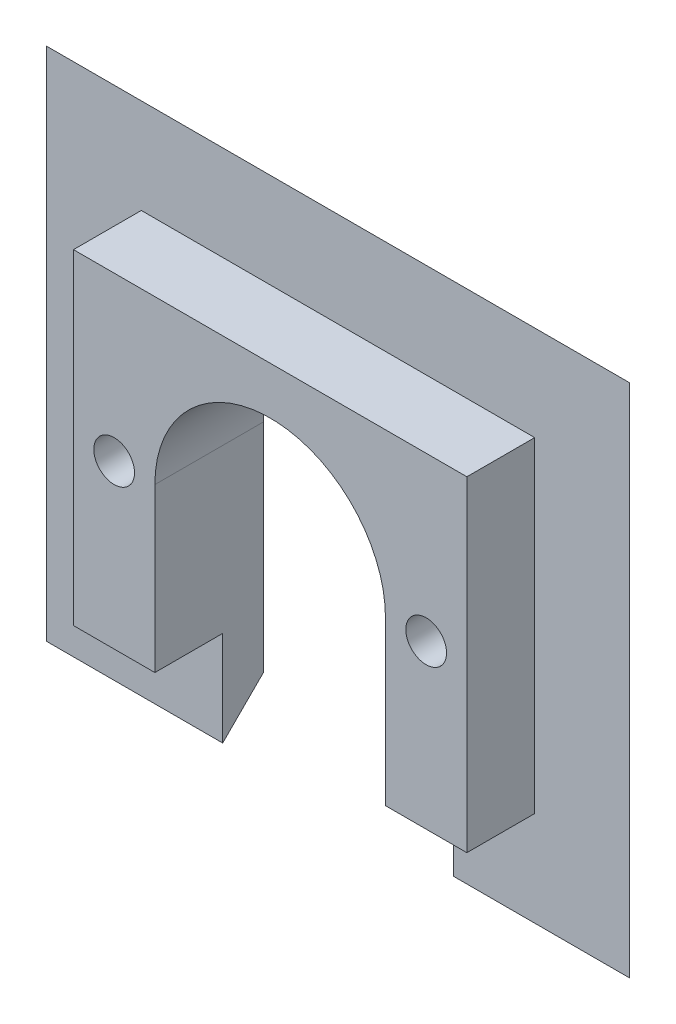
ISO-10303-21;
HEADER;
FILE_DESCRIPTION(('STEP AP214'),'2;1');
FILE_NAME('part.step','',(''),(''),'','','');
FILE_SCHEMA(('AUTOMOTIVE_DESIGN { 1 0 10303 214 1 1 1 1 }'));
ENDSEC;
DATA;
#1=APPLICATION_CONTEXT('core data for automotive mechanical design processes');
#2=APPLICATION_PROTOCOL_DEFINITION('international standard','automotive_design',2000,#1);
#3=PRODUCT_CONTEXT('',#1,'mechanical');
#4=PRODUCT('Part','Part','',(#3));
#5=PRODUCT_RELATED_PRODUCT_CATEGORY('part','',(#4));
#6=PRODUCT_DEFINITION_FORMATION('','',#4);
#7=PRODUCT_DEFINITION_CONTEXT('part definition',#1,'design');
#8=PRODUCT_DEFINITION('design','',#6,#7);
#9=PRODUCT_DEFINITION_SHAPE('','',#8);
#10=(LENGTH_UNIT() NAMED_UNIT(*) SI_UNIT(.MILLI.,.METRE.));
#11=(NAMED_UNIT(*) PLANE_ANGLE_UNIT() SI_UNIT($,.RADIAN.));
#12=(NAMED_UNIT(*) SI_UNIT($,.STERADIAN.) SOLID_ANGLE_UNIT());
#13=UNCERTAINTY_MEASURE_WITH_UNIT(LENGTH_MEASURE(1.E-05),#10,'distance_accuracy_value','');
#14=(GEOMETRIC_REPRESENTATION_CONTEXT(3) GLOBAL_UNCERTAINTY_ASSIGNED_CONTEXT((#13)) GLOBAL_UNIT_ASSIGNED_CONTEXT((#10,
#11,#12)) REPRESENTATION_CONTEXT('',''));
#15=CARTESIAN_POINT('',(0.,0.,0.));
#16=DIRECTION('',(0.,0.,1.));
#17=DIRECTION('',(1.,0.,0.));
#18=AXIS2_PLACEMENT_3D('',#15,#16,#17);
#19=CARTESIAN_POINT('',(0.,0.,5.));
#20=DIRECTION('',(0.,0.,-1.));
#21=DIRECTION('',(-1.,0.,0.));
#22=AXIS2_PLACEMENT_3D('',#19,#20,#21);
#23=CYLINDRICAL_SURFACE('',#22,8.5);
#24=DIRECTION('',(0.,0.,-1.));
#25=VECTOR('',#24,1.);
#26=CARTESIAN_POINT('',(-8.5,0.,5.));
#27=LINE('',#26,#25);
#28=CARTESIAN_POINT('',(-8.5,0.,5.));
#29=VERTEX_POINT('',#28);
#30=CARTESIAN_POINT('',(-8.5,0.,-3.));
#31=VERTEX_POINT('',#30);
#32=EDGE_CURVE('E168',#29,#31,#27,.T.);
#33=ORIENTED_EDGE('',*,*,#32,.T.);
#34=CARTESIAN_POINT('',(0.,0.,-3.));
#35=DIRECTION('',(0.,0.,1.));
#36=DIRECTION('',(1.,0.,0.));
#37=AXIS2_PLACEMENT_3D('',#34,#35,#36);
#38=CIRCLE('',#37,8.5);
#39=CARTESIAN_POINT('',(8.5,0.,-3.));
#40=VERTEX_POINT('',#39);
#41=EDGE_CURVE('E150',#40,#31,#38,.T.);
#42=ORIENTED_EDGE('',*,*,#41,.F.);
#43=DIRECTION('',(0.,0.,-1.));
#44=VECTOR('',#43,1.);
#45=CARTESIAN_POINT('',(8.5,0.,5.));
#46=LINE('',#45,#44);
#47=CARTESIAN_POINT('',(8.5,0.,5.));
#48=VERTEX_POINT('',#47);
#49=EDGE_CURVE('E158',#48,#40,#46,.T.);
#50=ORIENTED_EDGE('',*,*,#49,.F.);
#51=CARTESIAN_POINT('',(0.,0.,5.));
#52=DIRECTION('',(0.,0.,1.));
#53=DIRECTION('',(1.,0.,0.));
#54=AXIS2_PLACEMENT_3D('',#51,#52,#53);
#55=CIRCLE('',#54,8.5);
#56=EDGE_CURVE('E198',#48,#29,#55,.T.);
#57=ORIENTED_EDGE('',*,*,#56,.T.);
#58=EDGE_LOOP('',(#33,#42,#50,#57));
#59=FACE_BOUND('',#58,.T.);
#60=ADVANCED_FACE('F43',(#59),#23,.F.);
#61=CARTESIAN_POINT('',(8.5,0.,5.));
#62=DIRECTION('',(1.,0.,0.));
#63=DIRECTION('',(0.,1.,0.));
#64=AXIS2_PLACEMENT_3D('',#61,#62,#63);
#65=PLANE('',#64);
#66=DIRECTION('',(0.,1.,0.));
#67=VECTOR('',#66,1.);
#68=CARTESIAN_POINT('',(8.5,-19.,-3.));
#69=LINE('',#68,#67);
#70=CARTESIAN_POINT('',(8.5,-16.,-3.));
#71=VERTEX_POINT('',#70);
#72=EDGE_CURVE('E145',#71,#40,#69,.T.);
#73=ORIENTED_EDGE('',*,*,#72,.F.);
#74=DIRECTION('',(0.,0.707106781186546,-0.707106781186549));
#75=VECTOR('',#74,1.);
#76=CARTESIAN_POINT('',(8.49999999999999,-16.,-3.));
#77=LINE('',#76,#75);
#78=CARTESIAN_POINT('',(8.5,-19.,0.));
#79=VERTEX_POINT('',#78);
#80=EDGE_CURVE('E53',#71,#79,#77,.F.);
#81=ORIENTED_EDGE('',*,*,#80,.T.);
#82=DIRECTION('',(0.,1.,0.));
#83=VECTOR('',#82,1.);
#84=CARTESIAN_POINT('',(8.5,-12.,0.));
#85=LINE('',#84,#83);
#86=CARTESIAN_POINT('',(8.5,-12.,0.));
#87=VERTEX_POINT('',#86);
#88=EDGE_CURVE('E195',#79,#87,#85,.T.);
#89=ORIENTED_EDGE('',*,*,#88,.T.);
#90=DIRECTION('',(0.,0.,-1.));
#91=VECTOR('',#90,1.);
#92=CARTESIAN_POINT('',(8.5,-12.,5.));
#93=LINE('',#92,#91);
#94=CARTESIAN_POINT('',(8.5,-12.,5.));
#95=VERTEX_POINT('',#94);
#96=EDGE_CURVE('E166',#95,#87,#93,.T.);
#97=ORIENTED_EDGE('',*,*,#96,.F.);
#98=DIRECTION('',(0.,-1.,0.));
#99=VECTOR('',#98,1.);
#100=CARTESIAN_POINT('',(8.5,0.,5.));
#101=LINE('',#100,#99);
#102=EDGE_CURVE('E161',#48,#95,#101,.T.);
#103=ORIENTED_EDGE('',*,*,#102,.F.);
#104=ORIENTED_EDGE('',*,*,#49,.T.);
#105=EDGE_LOOP('',(#73,#81,#89,#97,#103,#104));
#106=FACE_BOUND('',#105,.T.);
#107=ADVANCED_FACE('F159',(#106),#65,.F.);
#108=CARTESIAN_POINT('',(0.,-12.,5.));
#109=DIRECTION('',(0.,1.,0.));
#110=DIRECTION('',(0.,0.,1.));
#111=AXIS2_PLACEMENT_3D('',#108,#109,#110);
#112=PLANE('',#111);
#113=DIRECTION('',(1.,0.,0.));
#114=VECTOR('',#113,1.);
#115=CARTESIAN_POINT('',(0.,-12.,0.));
#116=LINE('',#115,#114);
#117=CARTESIAN_POINT('',(14.5,-12.,0.));
#118=VERTEX_POINT('',#117);
#119=EDGE_CURVE('E169',#87,#118,#116,.T.);
#120=ORIENTED_EDGE('',*,*,#119,.T.);
#121=DIRECTION('',(0.,0.,-1.));
#122=VECTOR('',#121,1.);
#123=CARTESIAN_POINT('',(14.5,-12.,5.));
#124=LINE('',#123,#122);
#125=CARTESIAN_POINT('',(14.5,-12.,5.));
#126=VERTEX_POINT('',#125);
#127=EDGE_CURVE('E234',#126,#118,#124,.T.);
#128=ORIENTED_EDGE('',*,*,#127,.F.);
#129=DIRECTION('',(1.,0.,0.));
#130=VECTOR('',#129,1.);
#131=CARTESIAN_POINT('',(0.,-12.,5.));
#132=LINE('',#131,#130);
#133=EDGE_CURVE('E201',#95,#126,#132,.T.);
#134=ORIENTED_EDGE('',*,*,#133,.F.);
#135=ORIENTED_EDGE('',*,*,#96,.T.);
#136=EDGE_LOOP('',(#120,#128,#134,#135));
#137=FACE_BOUND('',#136,.T.);
#138=ADVANCED_FACE('F285',(#137),#112,.F.);
#139=CARTESIAN_POINT('',(14.5,0.,5.));
#140=DIRECTION('',(-1.,0.,0.));
#141=DIRECTION('',(0.,0.,1.));
#142=AXIS2_PLACEMENT_3D('',#139,#140,#141);
#143=PLANE('',#142);
#144=DIRECTION('',(0.,1.,0.));
#145=VECTOR('',#144,1.);
#146=CARTESIAN_POINT('',(14.5,0.,0.));
#147=LINE('',#146,#145);
#148=CARTESIAN_POINT('',(14.5,12.,0.));
#149=VERTEX_POINT('',#148);
#150=EDGE_CURVE('E172',#118,#149,#147,.T.);
#151=ORIENTED_EDGE('',*,*,#150,.T.);
#152=DIRECTION('',(0.,0.,-1.));
#153=VECTOR('',#152,1.);
#154=CARTESIAN_POINT('',(14.5,12.,5.));
#155=LINE('',#154,#153);
#156=CARTESIAN_POINT('',(14.5,12.,5.));
#157=VERTEX_POINT('',#156);
#158=EDGE_CURVE('E231',#157,#149,#155,.T.);
#159=ORIENTED_EDGE('',*,*,#158,.F.);
#160=DIRECTION('',(0.,1.,0.));
#161=VECTOR('',#160,1.);
#162=CARTESIAN_POINT('',(14.5,0.,5.));
#163=LINE('',#162,#161);
#164=EDGE_CURVE('E203',#126,#157,#163,.T.);
#165=ORIENTED_EDGE('',*,*,#164,.F.);
#166=ORIENTED_EDGE('',*,*,#127,.T.);
#167=EDGE_LOOP('',(#151,#159,#165,#166));
#168=FACE_BOUND('',#167,.T.);
#169=ADVANCED_FACE('F289',(#168),#143,.F.);
#170=CARTESIAN_POINT('',(0.,12.,5.));
#171=DIRECTION('',(0.,1.,0.));
#172=DIRECTION('',(0.,0.,1.));
#173=AXIS2_PLACEMENT_3D('',#170,#171,#172);
#174=PLANE('',#173);
#175=DIRECTION('',(1.,0.,0.));
#176=VECTOR('',#175,1.);
#177=CARTESIAN_POINT('',(0.,12.,0.));
#178=LINE('',#177,#176);
#179=CARTESIAN_POINT('',(-14.5,12.,0.));
#180=VERTEX_POINT('',#179);
#181=EDGE_CURVE('E217',#180,#149,#178,.T.);
#182=ORIENTED_EDGE('',*,*,#181,.F.);
#183=DIRECTION('',(0.,0.,-1.));
#184=VECTOR('',#183,1.);
#185=CARTESIAN_POINT('',(-14.5,12.,5.));
#186=LINE('',#185,#184);
#187=CARTESIAN_POINT('',(-14.5,12.,5.));
#188=VERTEX_POINT('',#187);
#189=EDGE_CURVE('E228',#188,#180,#186,.T.);
#190=ORIENTED_EDGE('',*,*,#189,.F.);
#191=DIRECTION('',(1.,0.,0.));
#192=VECTOR('',#191,1.);
#193=CARTESIAN_POINT('',(0.,12.,5.));
#194=LINE('',#193,#192);
#195=EDGE_CURVE('E206',#188,#157,#194,.T.);
#196=ORIENTED_EDGE('',*,*,#195,.T.);
#197=ORIENTED_EDGE('',*,*,#158,.T.);
#198=EDGE_LOOP('',(#182,#190,#196,#197));
#199=FACE_BOUND('',#198,.T.);
#200=ADVANCED_FACE('F307',(#199),#174,.T.);
#201=CARTESIAN_POINT('',(-14.5,0.,5.));
#202=DIRECTION('',(-1.,0.,0.));
#203=DIRECTION('',(0.,0.,1.));
#204=AXIS2_PLACEMENT_3D('',#201,#202,#203);
#205=PLANE('',#204);
#206=DIRECTION('',(0.,1.,0.));
#207=VECTOR('',#206,1.);
#208=CARTESIAN_POINT('',(-14.5,0.,0.));
#209=LINE('',#208,#207);
#210=CARTESIAN_POINT('',(-14.5,-12.,0.));
#211=VERTEX_POINT('',#210);
#212=EDGE_CURVE('E219',#211,#180,#209,.T.);
#213=ORIENTED_EDGE('',*,*,#212,.F.);
#214=DIRECTION('',(0.,0.,-1.));
#215=VECTOR('',#214,1.);
#216=CARTESIAN_POINT('',(-14.5,-12.,5.));
#217=LINE('',#216,#215);
#218=CARTESIAN_POINT('',(-14.5,-12.,5.));
#219=VERTEX_POINT('',#218);
#220=EDGE_CURVE('E225',#219,#211,#217,.T.);
#221=ORIENTED_EDGE('',*,*,#220,.F.);
#222=DIRECTION('',(0.,1.,0.));
#223=VECTOR('',#222,1.);
#224=CARTESIAN_POINT('',(-14.5,0.,5.));
#225=LINE('',#224,#223);
#226=EDGE_CURVE('E209',#219,#188,#225,.T.);
#227=ORIENTED_EDGE('',*,*,#226,.T.);
#228=ORIENTED_EDGE('',*,*,#189,.T.);
#229=EDGE_LOOP('',(#213,#221,#227,#228));
#230=FACE_BOUND('',#229,.T.);
#231=ADVANCED_FACE('F305',(#230),#205,.T.);
#232=CARTESIAN_POINT('',(-8.5,-12.,0.));
#233=VERTEX_POINT('',#232);
#234=EDGE_CURVE('E174',#211,#233,#116,.T.);
#235=ORIENTED_EDGE('',*,*,#234,.T.);
#236=DIRECTION('',(0.,0.,-1.));
#237=VECTOR('',#236,1.);
#238=CARTESIAN_POINT('',(-8.5,-12.,5.));
#239=LINE('',#238,#237);
#240=CARTESIAN_POINT('',(-8.5,-12.,5.));
#241=VERTEX_POINT('',#240);
#242=EDGE_CURVE('E222',#241,#233,#239,.T.);
#243=ORIENTED_EDGE('',*,*,#242,.F.);
#244=EDGE_CURVE('E204',#219,#241,#132,.T.);
#245=ORIENTED_EDGE('',*,*,#244,.F.);
#246=ORIENTED_EDGE('',*,*,#220,.T.);
#247=EDGE_LOOP('',(#235,#243,#245,#246));
#248=FACE_BOUND('',#247,.T.);
#249=ADVANCED_FACE('F301',(#248),#112,.F.);
#250=CARTESIAN_POINT('',(-8.5,0.,5.));
#251=DIRECTION('',(1.,0.,0.));
#252=DIRECTION('',(0.,0.,-1.));
#253=AXIS2_PLACEMENT_3D('',#250,#251,#252);
#254=PLANE('',#253);
#255=DIRECTION('',(0.,-1.,0.));
#256=VECTOR('',#255,1.);
#257=CARTESIAN_POINT('',(-8.5,-12.,0.));
#258=LINE('',#257,#256);
#259=CARTESIAN_POINT('',(-8.5,-19.,0.));
#260=VERTEX_POINT('',#259);
#261=EDGE_CURVE('E177',#233,#260,#258,.T.);
#262=ORIENTED_EDGE('',*,*,#261,.T.);
#263=DIRECTION('',(0.,-0.707106781186546,0.707106781186549));
#264=VECTOR('',#263,1.);
#265=CARTESIAN_POINT('',(-8.5,-12.,-6.99999999999998));
#266=LINE('',#265,#264);
#267=CARTESIAN_POINT('',(-8.5,-16.,-3.));
#268=VERTEX_POINT('',#267);
#269=EDGE_CURVE('E11',#260,#268,#266,.F.);
#270=ORIENTED_EDGE('',*,*,#269,.T.);
#271=DIRECTION('',(0.,-1.,0.));
#272=VECTOR('',#271,1.);
#273=CARTESIAN_POINT('',(-8.5,-12.,-3.));
#274=LINE('',#273,#272);
#275=EDGE_CURVE('E155',#31,#268,#274,.T.);
#276=ORIENTED_EDGE('',*,*,#275,.F.);
#277=ORIENTED_EDGE('',*,*,#32,.F.);
#278=DIRECTION('',(0.,-1.,0.));
#279=VECTOR('',#278,1.);
#280=CARTESIAN_POINT('',(-8.5,0.,5.));
#281=LINE('',#280,#279);
#282=EDGE_CURVE('E212',#29,#241,#281,.T.);
#283=ORIENTED_EDGE('',*,*,#282,.T.);
#284=ORIENTED_EDGE('',*,*,#242,.T.);
#285=EDGE_LOOP('',(#262,#270,#276,#277,#283,#284));
#286=FACE_BOUND('',#285,.T.);
#287=ADVANCED_FACE('F298',(#286),#254,.T.);
#288=CARTESIAN_POINT('',(0.,0.,5.));
#289=DIRECTION('',(0.,0.,1.));
#290=DIRECTION('',(1.,0.,0.));
#291=AXIS2_PLACEMENT_3D('',#288,#289,#290);
#292=PLANE('',#291);
#293=CARTESIAN_POINT('',(11.5,0.,5.));
#294=DIRECTION('',(0.,0.,1.));
#295=DIRECTION('',(1.,0.,0.));
#296=AXIS2_PLACEMENT_3D('',#293,#294,#295);
#297=CIRCLE('',#296,1.5);
#298=CARTESIAN_POINT('',(13.,0.,5.));
#299=VERTEX_POINT('',#298);
#300=EDGE_CURVE('E266',#299,#299,#297,.T.);
#301=ORIENTED_EDGE('',*,*,#300,.F.);
#302=EDGE_LOOP('',(#301));
#303=FACE_BOUND('',#302,.T.);
#304=CARTESIAN_POINT('',(-11.5,0.,5.));
#305=DIRECTION('',(0.,0.,1.));
#306=DIRECTION('',(1.,0.,0.));
#307=AXIS2_PLACEMENT_3D('',#304,#305,#306);
#308=CIRCLE('',#307,1.5);
#309=CARTESIAN_POINT('',(-10.,0.,5.));
#310=VERTEX_POINT('',#309);
#311=EDGE_CURVE('E261',#310,#310,#308,.T.);
#312=ORIENTED_EDGE('',*,*,#311,.F.);
#313=EDGE_LOOP('',(#312));
#314=FACE_BOUND('',#313,.T.);
#315=ORIENTED_EDGE('',*,*,#56,.F.);
#316=ORIENTED_EDGE('',*,*,#102,.T.);
#317=ORIENTED_EDGE('',*,*,#133,.T.);
#318=ORIENTED_EDGE('',*,*,#164,.T.);
#319=ORIENTED_EDGE('',*,*,#195,.F.);
#320=ORIENTED_EDGE('',*,*,#226,.F.);
#321=ORIENTED_EDGE('',*,*,#244,.T.);
#322=ORIENTED_EDGE('',*,*,#282,.F.);
#323=EDGE_LOOP('',(#315,#316,#317,#318,#319,#320,#321,#322));
#324=FACE_BOUND('',#323,.T.);
#325=ADVANCED_FACE('F293',(#303,#314,#324),#292,.T.);
#326=CARTESIAN_POINT('',(0.,0.,0.));
#327=DIRECTION('',(0.,0.,1.));
#328=DIRECTION('',(1.,0.,0.));
#329=AXIS2_PLACEMENT_3D('',#326,#327,#328);
#330=PLANE('',#329);
#331=ORIENTED_EDGE('',*,*,#234,.F.);
#332=ORIENTED_EDGE('',*,*,#212,.T.);
#333=ORIENTED_EDGE('',*,*,#181,.T.);
#334=ORIENTED_EDGE('',*,*,#150,.F.);
#335=ORIENTED_EDGE('',*,*,#119,.F.);
#336=ORIENTED_EDGE('',*,*,#88,.F.);
#337=DIRECTION('',(-1.,0.,0.));
#338=VECTOR('',#337,1.);
#339=CARTESIAN_POINT('',(21.5,-19.,0.));
#340=LINE('',#339,#338);
#341=CARTESIAN_POINT('',(21.5,-19.,0.));
#342=VERTEX_POINT('',#341);
#343=EDGE_CURVE('E192',#342,#79,#340,.T.);
#344=ORIENTED_EDGE('',*,*,#343,.F.);
#345=DIRECTION('',(0.,-1.,0.));
#346=VECTOR('',#345,1.);
#347=CARTESIAN_POINT('',(21.5,19.,0.));
#348=LINE('',#347,#346);
#349=CARTESIAN_POINT('',(21.5,19.,0.));
#350=VERTEX_POINT('',#349);
#351=EDGE_CURVE('E189',#350,#342,#348,.T.);
#352=ORIENTED_EDGE('',*,*,#351,.F.);
#353=DIRECTION('',(1.,0.,0.));
#354=VECTOR('',#353,1.);
#355=CARTESIAN_POINT('',(-21.5,19.,0.));
#356=LINE('',#355,#354);
#357=CARTESIAN_POINT('',(-21.5,19.,0.));
#358=VERTEX_POINT('',#357);
#359=EDGE_CURVE('E186',#358,#350,#356,.T.);
#360=ORIENTED_EDGE('',*,*,#359,.F.);
#361=DIRECTION('',(0.,1.,0.));
#362=VECTOR('',#361,1.);
#363=CARTESIAN_POINT('',(-21.5,-19.,0.));
#364=LINE('',#363,#362);
#365=CARTESIAN_POINT('',(-21.5,-19.,0.));
#366=VERTEX_POINT('',#365);
#367=EDGE_CURVE('E183',#366,#358,#364,.T.);
#368=ORIENTED_EDGE('',*,*,#367,.F.);
#369=DIRECTION('',(-1.,0.,0.));
#370=VECTOR('',#369,1.);
#371=CARTESIAN_POINT('',(-8.5,-19.,0.));
#372=LINE('',#371,#370);
#373=EDGE_CURVE('E179',#260,#366,#372,.T.);
#374=ORIENTED_EDGE('',*,*,#373,.F.);
#375=ORIENTED_EDGE('',*,*,#261,.F.);
#376=EDGE_LOOP('',(#331,#332,#333,#334,#335,#336,#344,#352,#360,#368,#374,#375));
#377=FACE_BOUND('',#376,.T.);
#378=ADVANCED_FACE('F282',(#377),#330,.T.);
#379=CARTESIAN_POINT('',(0.,0.,-3.));
#380=DIRECTION('',(0.,0.,1.));
#381=DIRECTION('',(1.,0.,0.));
#382=AXIS2_PLACEMENT_3D('',#379,#380,#381);
#383=PLANE('',#382);
#384=CARTESIAN_POINT('',(11.5,0.,-3.));
#385=DIRECTION('',(0.,0.,1.));
#386=DIRECTION('',(1.,0.,0.));
#387=AXIS2_PLACEMENT_3D('',#384,#385,#386);
#388=CIRCLE('',#387,1.5);
#389=CARTESIAN_POINT('',(13.,0.,-3.));
#390=VERTEX_POINT('',#389);
#391=EDGE_CURVE('E180',#390,#390,#388,.T.);
#392=ORIENTED_EDGE('',*,*,#391,.T.);
#393=EDGE_LOOP('',(#392));
#394=FACE_BOUND('',#393,.T.);
#395=CARTESIAN_POINT('',(-11.5,0.,-3.));
#396=DIRECTION('',(0.,0.,1.));
#397=DIRECTION('',(1.,0.,0.));
#398=AXIS2_PLACEMENT_3D('',#395,#396,#397);
#399=CIRCLE('',#398,1.5);
#400=CARTESIAN_POINT('',(-10.,0.,-3.));
#401=VERTEX_POINT('',#400);
#402=EDGE_CURVE('E256',#401,#401,#399,.T.);
#403=ORIENTED_EDGE('',*,*,#402,.T.);
#404=EDGE_LOOP('',(#403));
#405=FACE_BOUND('',#404,.T.);
#406=DIRECTION('',(0.,-1.,0.));
#407=VECTOR('',#406,1.);
#408=CARTESIAN_POINT('',(18.5,0.,-3.));
#409=LINE('',#408,#407);
#410=CARTESIAN_POINT('',(18.5,16.,-3.));
#411=VERTEX_POINT('',#410);
#412=CARTESIAN_POINT('',(18.5,-16.,-3.));
#413=VERTEX_POINT('',#412);
#414=EDGE_CURVE('E61',#411,#413,#409,.T.);
#415=ORIENTED_EDGE('',*,*,#414,.T.);
#416=DIRECTION('',(-1.,0.,0.));
#417=VECTOR('',#416,1.);
#418=CARTESIAN_POINT('',(0.,-16.,-3.));
#419=LINE('',#418,#417);
#420=EDGE_CURVE('E153',#413,#71,#419,.T.);
#421=ORIENTED_EDGE('',*,*,#420,.T.);
#422=ORIENTED_EDGE('',*,*,#72,.T.);
#423=ORIENTED_EDGE('',*,*,#41,.T.);
#424=ORIENTED_EDGE('',*,*,#275,.T.);
#425=DIRECTION('',(-1.,0.,0.));
#426=VECTOR('',#425,1.);
#427=CARTESIAN_POINT('',(0.,-16.,-3.));
#428=LINE('',#427,#426);
#429=CARTESIAN_POINT('',(-18.5,-16.,-3.));
#430=VERTEX_POINT('',#429);
#431=EDGE_CURVE('E165',#268,#430,#428,.T.);
#432=ORIENTED_EDGE('',*,*,#431,.T.);
#433=DIRECTION('',(0.,1.,0.));
#434=VECTOR('',#433,1.);
#435=CARTESIAN_POINT('',(-18.5,0.,-3.));
#436=LINE('',#435,#434);
#437=CARTESIAN_POINT('',(-18.5,16.,-3.));
#438=VERTEX_POINT('',#437);
#439=EDGE_CURVE('E240',#430,#438,#436,.T.);
#440=ORIENTED_EDGE('',*,*,#439,.T.);
#441=DIRECTION('',(1.,0.,0.));
#442=VECTOR('',#441,1.);
#443=CARTESIAN_POINT('',(0.,16.,-3.));
#444=LINE('',#443,#442);
#445=EDGE_CURVE('E66',#438,#411,#444,.T.);
#446=ORIENTED_EDGE('',*,*,#445,.T.);
#447=EDGE_LOOP('',(#415,#421,#422,#423,#424,#432,#440,#446));
#448=FACE_BOUND('',#447,.T.);
#449=ADVANCED_FACE('F147',(#394,#405,#448),#383,.F.);
#450=CARTESIAN_POINT('',(-11.5,0.,-3.));
#451=DIRECTION('',(0.,0.,1.));
#452=DIRECTION('',(1.,0.,0.));
#453=AXIS2_PLACEMENT_3D('',#450,#451,#452);
#454=CYLINDRICAL_SURFACE('',#453,1.5);
#455=ORIENTED_EDGE('',*,*,#402,.F.);
#456=EDGE_LOOP('',(#455));
#457=FACE_BOUND('',#456,.T.);
#458=ORIENTED_EDGE('',*,*,#311,.T.);
#459=EDGE_LOOP('',(#458));
#460=FACE_BOUND('',#459,.T.);
#461=ADVANCED_FACE('F348',(#457,#460),#454,.F.);
#462=CARTESIAN_POINT('',(11.5,0.,-3.));
#463=DIRECTION('',(0.,0.,1.));
#464=DIRECTION('',(1.,0.,0.));
#465=AXIS2_PLACEMENT_3D('',#462,#463,#464);
#466=CYLINDRICAL_SURFACE('',#465,1.5);
#467=ORIENTED_EDGE('',*,*,#391,.F.);
#468=EDGE_LOOP('',(#467));
#469=FACE_BOUND('',#468,.T.);
#470=ORIENTED_EDGE('',*,*,#300,.T.);
#471=EDGE_LOOP('',(#470));
#472=FACE_BOUND('',#471,.T.);
#473=ADVANCED_FACE('F344',(#469,#472),#466,.F.);
#474=CARTESIAN_POINT('',(0.,-16.,-3.));
#475=DIRECTION('',(0.,0.707106781186549,0.707106781186546));
#476=DIRECTION('',(-1.,0.,0.));
#477=AXIS2_PLACEMENT_3D('',#474,#475,#476);
#478=PLANE('',#477);
#479=ORIENTED_EDGE('',*,*,#269,.F.);
#480=ORIENTED_EDGE('',*,*,#373,.T.);
#481=DIRECTION('',(0.577350269189625,0.577350269189625,-0.577350269189628));
#482=VECTOR('',#481,1.);
#483=CARTESIAN_POINT('',(-12.3333333333334,-9.83333333333336,-9.16666666666668));
#484=LINE('',#483,#482);
#485=EDGE_CURVE('E48',#430,#366,#484,.F.);
#486=ORIENTED_EDGE('',*,*,#485,.F.);
#487=ORIENTED_EDGE('',*,*,#431,.F.);
#488=EDGE_LOOP('',(#479,#480,#486,#487));
#489=FACE_BOUND('',#488,.T.);
#490=ADVANCED_FACE('F46',(#489),#478,.F.);
#491=CARTESIAN_POINT('',(-18.5,0.,-3.));
#492=DIRECTION('',(0.707106781186549,0.,0.707106781186546));
#493=DIRECTION('',(0.,1.,0.));
#494=AXIS2_PLACEMENT_3D('',#491,#492,#493);
#495=PLANE('',#494);
#496=ORIENTED_EDGE('',*,*,#485,.T.);
#497=ORIENTED_EDGE('',*,*,#367,.T.);
#498=DIRECTION('',(0.577350269189625,-0.577350269189625,-0.577350269189628));
#499=VECTOR('',#498,1.);
#500=CARTESIAN_POINT('',(-13.1666666666667,10.6666666666667,-8.33333333333336));
#501=LINE('',#500,#499);
#502=EDGE_CURVE('E251',#438,#358,#501,.F.);
#503=ORIENTED_EDGE('',*,*,#502,.F.);
#504=ORIENTED_EDGE('',*,*,#439,.F.);
#505=EDGE_LOOP('',(#496,#497,#503,#504));
#506=FACE_BOUND('',#505,.T.);
#507=ADVANCED_FACE('F274',(#506),#495,.F.);
#508=CARTESIAN_POINT('',(0.,16.,-3.));
#509=DIRECTION('',(0.,-0.707106781186549,0.707106781186546));
#510=DIRECTION('',(1.,0.,0.));
#511=AXIS2_PLACEMENT_3D('',#508,#509,#510);
#512=PLANE('',#511);
#513=ORIENTED_EDGE('',*,*,#502,.T.);
#514=ORIENTED_EDGE('',*,*,#359,.T.);
#515=DIRECTION('',(-0.577350269189625,-0.577350269189625,-0.577350269189628));
#516=VECTOR('',#515,1.);
#517=CARTESIAN_POINT('',(12.3333333333334,9.83333333333335,-9.16666666666667));
#518=LINE('',#517,#516);
#519=EDGE_CURVE('E249',#411,#350,#518,.F.);
#520=ORIENTED_EDGE('',*,*,#519,.F.);
#521=ORIENTED_EDGE('',*,*,#445,.F.);
#522=EDGE_LOOP('',(#513,#514,#520,#521));
#523=FACE_BOUND('',#522,.T.);
#524=ADVANCED_FACE('F275',(#523),#512,.F.);
#525=CARTESIAN_POINT('',(18.5,0.,-3.));
#526=DIRECTION('',(-0.707106781186549,0.,0.707106781186546));
#527=DIRECTION('',(0.,-1.,0.));
#528=AXIS2_PLACEMENT_3D('',#525,#526,#527);
#529=PLANE('',#528);
#530=ORIENTED_EDGE('',*,*,#519,.T.);
#531=ORIENTED_EDGE('',*,*,#351,.T.);
#532=DIRECTION('',(-0.577350269189625,0.577350269189625,-0.577350269189628));
#533=VECTOR('',#532,1.);
#534=CARTESIAN_POINT('',(13.1666666666667,-10.6666666666667,-8.33333333333333));
#535=LINE('',#534,#533);
#536=EDGE_CURVE('E246',#413,#342,#535,.F.);
#537=ORIENTED_EDGE('',*,*,#536,.F.);
#538=ORIENTED_EDGE('',*,*,#414,.F.);
#539=EDGE_LOOP('',(#530,#531,#537,#538));
#540=FACE_BOUND('',#539,.T.);
#541=ADVANCED_FACE('F277',(#540),#529,.F.);
#542=CARTESIAN_POINT('',(0.,-16.,-3.));
#543=DIRECTION('',(0.,0.707106781186549,0.707106781186546));
#544=DIRECTION('',(-1.,0.,0.));
#545=AXIS2_PLACEMENT_3D('',#542,#543,#544);
#546=PLANE('',#545);
#547=ORIENTED_EDGE('',*,*,#536,.T.);
#548=ORIENTED_EDGE('',*,*,#343,.T.);
#549=ORIENTED_EDGE('',*,*,#80,.F.);
#550=ORIENTED_EDGE('',*,*,#420,.F.);
#551=EDGE_LOOP('',(#547,#548,#549,#550));
#552=FACE_BOUND('',#551,.T.);
#553=ADVANCED_FACE('F279',(#552),#546,.F.);
#554=CLOSED_SHELL('',(#60,#107,#138,#169,#200,#231,#249,#287,#325,#378,#449,#461,#473,#490,#507,
#524,#541,#553));
#555=MANIFOLD_SOLID_BREP('B2',#554);
#556=ADVANCED_BREP_SHAPE_REPRESENTATION('',(#18,#555),#14);
#557=SHAPE_DEFINITION_REPRESENTATION(#9,#556);
ENDSEC;
END-ISO-10303-21;
